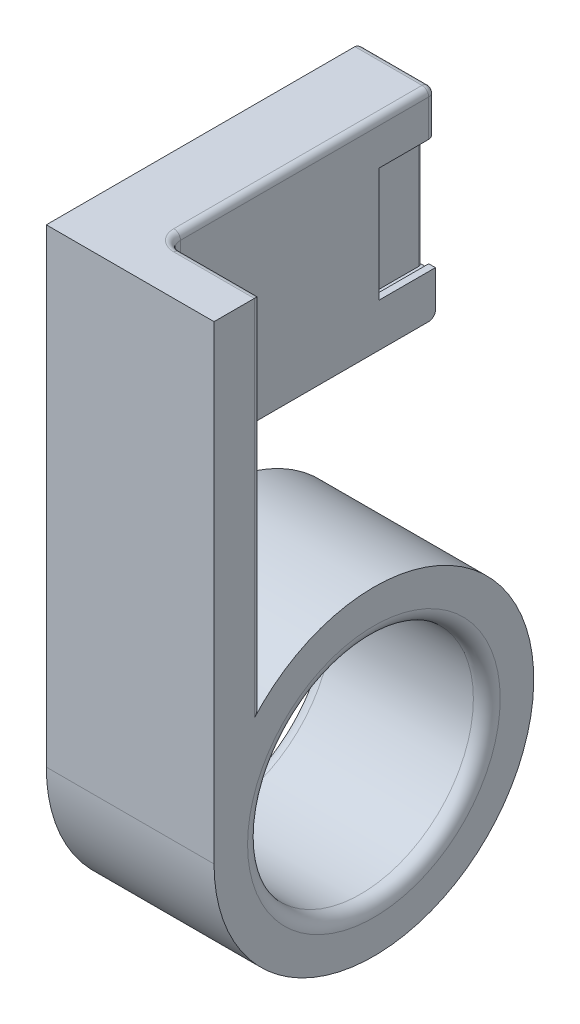
ISO-10303-21;
HEADER;
FILE_DESCRIPTION(('STEP AP214'),'2;1');
FILE_NAME('part.step','',(''),(''),'','','');
FILE_SCHEMA(('AUTOMOTIVE_DESIGN { 1 0 10303 214 1 1 1 1 }'));
ENDSEC;
DATA;
#1=APPLICATION_CONTEXT('core data for automotive mechanical design processes');
#2=APPLICATION_PROTOCOL_DEFINITION('international standard','automotive_design',2000,#1);
#3=PRODUCT_CONTEXT('',#1,'mechanical');
#4=PRODUCT('Part','Part','',(#3));
#5=PRODUCT_RELATED_PRODUCT_CATEGORY('part','',(#4));
#6=PRODUCT_DEFINITION_FORMATION('','',#4);
#7=PRODUCT_DEFINITION_CONTEXT('part definition',#1,'design');
#8=PRODUCT_DEFINITION('design','',#6,#7);
#9=PRODUCT_DEFINITION_SHAPE('','',#8);
#10=(LENGTH_UNIT() NAMED_UNIT(*) SI_UNIT(.MILLI.,.METRE.));
#11=(NAMED_UNIT(*) PLANE_ANGLE_UNIT() SI_UNIT($,.RADIAN.));
#12=(NAMED_UNIT(*) SI_UNIT($,.STERADIAN.) SOLID_ANGLE_UNIT());
#13=UNCERTAINTY_MEASURE_WITH_UNIT(LENGTH_MEASURE(1.E-05),#10,'distance_accuracy_value','');
#14=(GEOMETRIC_REPRESENTATION_CONTEXT(3) GLOBAL_UNCERTAINTY_ASSIGNED_CONTEXT((#13)) GLOBAL_UNIT_ASSIGNED_CONTEXT((#10,
#11,#12)) REPRESENTATION_CONTEXT('',''));
#15=CARTESIAN_POINT('',(0.,0.,0.));
#16=DIRECTION('',(0.,0.,1.));
#17=DIRECTION('',(1.,0.,0.));
#18=AXIS2_PLACEMENT_3D('',#15,#16,#17);
#19=CARTESIAN_POINT('',(11.,70.,-23.1725));
#20=DIRECTION('',(-1.,0.,0.));
#21=DIRECTION('',(0.,-1.,0.));
#22=AXIS2_PLACEMENT_3D('',#19,#20,#21);
#23=PLANE('',#22);
#24=DIRECTION('',(0.,0.,-1.));
#25=VECTOR('',#24,1.);
#26=CARTESIAN_POINT('',(11.,63.525,0.));
#27=LINE('',#26,#25);
#28=CARTESIAN_POINT('',(11.,63.525,-14.7725));
#29=VERTEX_POINT('',#28);
#30=CARTESIAN_POINT('',(11.,63.525,-22.1725));
#31=VERTEX_POINT('',#30);
#32=EDGE_CURVE('E259',#29,#31,#27,.T.);
#33=ORIENTED_EDGE('',*,*,#32,.T.);
#34=DIRECTION('',(0.,-1.,0.));
#35=VECTOR('',#34,1.);
#36=CARTESIAN_POINT('',(11.,70.,-22.1725));
#37=LINE('',#36,#35);
#38=CARTESIAN_POINT('',(11.,69.,-22.1725));
#39=VERTEX_POINT('',#38);
#40=EDGE_CURVE('E410',#31,#39,#37,.F.);
#41=ORIENTED_EDGE('',*,*,#40,.T.);
#42=DIRECTION('',(0.,0.,1.));
#43=VECTOR('',#42,1.);
#44=CARTESIAN_POINT('',(11.,69.,-23.1725));
#45=LINE('',#44,#43);
#46=CARTESIAN_POINT('',(11.,69.,14.8275));
#47=VERTEX_POINT('',#46);
#48=EDGE_CURVE('E407',#39,#47,#45,.T.);
#49=ORIENTED_EDGE('',*,*,#48,.T.);
#50=DIRECTION('',(0.,-1.,0.));
#51=VECTOR('',#50,1.);
#52=CARTESIAN_POINT('',(11.,40.,14.8275));
#53=LINE('',#52,#51);
#54=CARTESIAN_POINT('',(11.,40.,14.8275));
#55=VERTEX_POINT('',#54);
#56=EDGE_CURVE('E390',#47,#55,#53,.T.);
#57=ORIENTED_EDGE('',*,*,#56,.T.);
#58=DIRECTION('',(0.,0.,1.));
#59=VECTOR('',#58,1.);
#60=CARTESIAN_POINT('',(11.,40.,-23.1725));
#61=LINE('',#60,#59);
#62=CARTESIAN_POINT('',(11.,40.,-22.1725));
#63=VERTEX_POINT('',#62);
#64=EDGE_CURVE('E296',#63,#55,#61,.T.);
#65=ORIENTED_EDGE('',*,*,#64,.F.);
#66=CARTESIAN_POINT('',(11.,41.,-22.1725));
#67=DIRECTION('',(-1.,0.,0.));
#68=DIRECTION('',(0.,-1.,0.));
#69=AXIS2_PLACEMENT_3D('',#66,#67,#68);
#70=CIRCLE('',#69,1.);
#71=CARTESIAN_POINT('',(11.,41.,-23.1725));
#72=VERTEX_POINT('',#71);
#73=EDGE_CURVE('E358',#63,#72,#70,.F.);
#74=ORIENTED_EDGE('',*,*,#73,.T.);
#75=DIRECTION('',(0.,-1.,0.));
#76=VECTOR('',#75,1.);
#77=CARTESIAN_POINT('',(11.,70.,-23.1725));
#78=LINE('',#77,#76);
#79=CARTESIAN_POINT('',(11.,46.475,-23.1725));
#80=VERTEX_POINT('',#79);
#81=EDGE_CURVE('E286',#80,#72,#78,.T.);
#82=ORIENTED_EDGE('',*,*,#81,.F.);
#83=DIRECTION('',(0.,0.,-1.));
#84=VECTOR('',#83,1.);
#85=CARTESIAN_POINT('',(11.,46.475,0.));
#86=LINE('',#85,#84);
#87=CARTESIAN_POINT('',(11.,46.475,-14.7725));
#88=VERTEX_POINT('',#87);
#89=EDGE_CURVE('E270',#88,#80,#86,.T.);
#90=ORIENTED_EDGE('',*,*,#89,.F.);
#91=DIRECTION('',(0.,-1.,0.));
#92=VECTOR('',#91,1.);
#93=CARTESIAN_POINT('',(11.,0.,-14.7725));
#94=LINE('',#93,#92);
#95=EDGE_CURVE('E250',#29,#88,#94,.T.);
#96=ORIENTED_EDGE('',*,*,#95,.F.);
#97=EDGE_LOOP('',(#33,#41,#49,#57,#65,#74,#82,#90,#96));
#98=FACE_BOUND('',#97,.T.);
#99=ADVANCED_FACE('F47',(#98),#23,.F.);
#100=CARTESIAN_POINT('',(0.,0.,-23.1725));
#101=DIRECTION('',(0.,0.,1.));
#102=DIRECTION('',(1.,0.,0.));
#103=AXIS2_PLACEMENT_3D('',#100,#101,#102);
#104=PLANE('',#103);
#105=DIRECTION('',(1.,0.,0.));
#106=VECTOR('',#105,1.);
#107=CARTESIAN_POINT('',(0.,69.,-23.1725));
#108=LINE('',#107,#106);
#109=CARTESIAN_POINT('',(1.,69.,-23.1725));
#110=VERTEX_POINT('',#109);
#111=CARTESIAN_POINT('',(10.,69.,-23.1725));
#112=VERTEX_POINT('',#111);
#113=EDGE_CURVE('E344',#110,#112,#108,.T.);
#114=ORIENTED_EDGE('',*,*,#113,.T.);
#115=DIRECTION('',(0.,-1.,0.));
#116=VECTOR('',#115,1.);
#117=CARTESIAN_POINT('',(9.99999999999999,0.,-23.1725));
#118=LINE('',#117,#116);
#119=CARTESIAN_POINT('',(10.,64.125,-23.1725));
#120=VERTEX_POINT('',#119);
#121=EDGE_CURVE('E400',#112,#120,#118,.T.);
#122=ORIENTED_EDGE('',*,*,#121,.T.);
#123=DIRECTION('',(1.,0.,0.));
#124=VECTOR('',#123,1.);
#125=CARTESIAN_POINT('',(9.,64.125,-23.1725));
#126=LINE('',#125,#124);
#127=CARTESIAN_POINT('',(8.49999999999999,64.125,-23.1725));
#128=VERTEX_POINT('',#127);
#129=EDGE_CURVE('E224',#128,#120,#126,.T.);
#130=ORIENTED_EDGE('',*,*,#129,.F.);
#131=DIRECTION('',(0.,1.,0.));
#132=VECTOR('',#131,1.);
#133=CARTESIAN_POINT('',(8.49999999999999,45.875,-23.1725));
#134=LINE('',#133,#132);
#135=CARTESIAN_POINT('',(8.49999999999999,45.875,-23.1725));
#136=VERTEX_POINT('',#135);
#137=EDGE_CURVE('E334',#128,#136,#134,.F.);
#138=ORIENTED_EDGE('',*,*,#137,.T.);
#139=DIRECTION('',(1.,0.,0.));
#140=VECTOR('',#139,1.);
#141=CARTESIAN_POINT('',(8.99999999999999,45.875,-23.1725));
#142=LINE('',#141,#140);
#143=CARTESIAN_POINT('',(9.99999999999999,45.875,-23.1725));
#144=VERTEX_POINT('',#143);
#145=EDGE_CURVE('E246',#136,#144,#142,.T.);
#146=ORIENTED_EDGE('',*,*,#145,.T.);
#147=DIRECTION('',(0.,1.,0.));
#148=VECTOR('',#147,1.);
#149=CARTESIAN_POINT('',(10.,64.125,-23.1725));
#150=LINE('',#149,#148);
#151=CARTESIAN_POINT('',(9.99999999999999,46.475,-23.1725));
#152=VERTEX_POINT('',#151);
#153=EDGE_CURVE('E233',#144,#152,#150,.T.);
#154=ORIENTED_EDGE('',*,*,#153,.T.);
#155=DIRECTION('',(1.,0.,0.));
#156=VECTOR('',#155,1.);
#157=CARTESIAN_POINT('',(9.99999999999999,46.475,-23.1725));
#158=LINE('',#157,#156);
#159=EDGE_CURVE('E280',#152,#80,#158,.T.);
#160=ORIENTED_EDGE('',*,*,#159,.T.);
#161=ORIENTED_EDGE('',*,*,#81,.T.);
#162=DIRECTION('',(-1.,0.,0.));
#163=VECTOR('',#162,1.);
#164=CARTESIAN_POINT('',(0.,41.,-23.1725));
#165=LINE('',#164,#163);
#166=CARTESIAN_POINT('',(1.,41.,-23.1725));
#167=VERTEX_POINT('',#166);
#168=EDGE_CURVE('E351',#72,#167,#165,.T.);
#169=ORIENTED_EDGE('',*,*,#168,.T.);
#170=DIRECTION('',(0.,1.,0.));
#171=VECTOR('',#170,1.);
#172=CARTESIAN_POINT('',(1.,0.,-23.1725));
#173=LINE('',#172,#171);
#174=EDGE_CURVE('E348',#167,#110,#173,.T.);
#175=ORIENTED_EDGE('',*,*,#174,.T.);
#176=EDGE_LOOP('',(#114,#122,#130,#138,#146,#154,#160,#161,#169,#175));
#177=FACE_BOUND('',#176,.T.);
#178=ADVANCED_FACE('F505',(#177),#104,.F.);
#179=CARTESIAN_POINT('',(0.,70.,16.8275));
#180=DIRECTION('',(0.,0.,1.));
#181=DIRECTION('',(1.,0.,0.));
#182=AXIS2_PLACEMENT_3D('',#179,#180,#181);
#183=PLANE('',#182);
#184=DIRECTION('',(0.,-1.,0.));
#185=VECTOR('',#184,1.);
#186=CARTESIAN_POINT('',(13.,70.,16.8275));
#187=LINE('',#186,#185);
#188=CARTESIAN_POINT('',(13.,40.,16.8275));
#189=VERTEX_POINT('',#188);
#190=CARTESIAN_POINT('',(13.,69.,16.8275));
#191=VERTEX_POINT('',#190);
#192=EDGE_CURVE('E393',#189,#191,#187,.F.);
#193=ORIENTED_EDGE('',*,*,#192,.T.);
#194=DIRECTION('',(-1.,0.,0.));
#195=VECTOR('',#194,1.);
#196=CARTESIAN_POINT('',(0.,69.,16.8275));
#197=LINE('',#196,#195);
#198=CARTESIAN_POINT('',(24.,69.,16.8275));
#199=VERTEX_POINT('',#198);
#200=EDGE_CURVE('E73',#191,#199,#197,.F.);
#201=ORIENTED_EDGE('',*,*,#200,.T.);
#202=DIRECTION('',(0.,-1.,0.));
#203=VECTOR('',#202,1.);
#204=CARTESIAN_POINT('',(24.,16.8696472992176,16.8275));
#205=LINE('',#204,#203);
#206=CARTESIAN_POINT('',(24.,16.8696472992176,16.8275));
#207=VERTEX_POINT('',#206);
#208=EDGE_CURVE('E428',#199,#207,#205,.T.);
#209=ORIENTED_EDGE('',*,*,#208,.T.);
#210=DIRECTION('',(-1.,0.,0.));
#211=VECTOR('',#210,1.);
#212=CARTESIAN_POINT('',(25.,16.8696472992176,16.8275));
#213=LINE('',#212,#211);
#214=CARTESIAN_POINT('',(0.,16.8696472992176,16.8275));
#215=VERTEX_POINT('',#214);
#216=EDGE_CURVE('E323',#207,#215,#213,.T.);
#217=ORIENTED_EDGE('',*,*,#216,.T.);
#218=DIRECTION('',(0.,-1.,0.));
#219=VECTOR('',#218,1.);
#220=CARTESIAN_POINT('',(0.,70.,16.8275));
#221=LINE('',#220,#219);
#222=CARTESIAN_POINT('',(0.,40.,16.8275));
#223=VERTEX_POINT('',#222);
#224=EDGE_CURVE('E311',#223,#215,#221,.T.);
#225=ORIENTED_EDGE('',*,*,#224,.F.);
#226=DIRECTION('',(-1.,0.,0.));
#227=VECTOR('',#226,1.);
#228=CARTESIAN_POINT('',(0.,40.,16.8275));
#229=LINE('',#228,#227);
#230=EDGE_CURVE('E279',#189,#223,#229,.T.);
#231=ORIENTED_EDGE('',*,*,#230,.F.);
#232=EDGE_LOOP('',(#193,#201,#209,#217,#225,#231));
#233=FACE_BOUND('',#232,.T.);
#234=ADVANCED_FACE('F448',(#233),#183,.F.);
#235=CARTESIAN_POINT('',(25.,0.,0.));
#236=DIRECTION('',(-1.,0.,0.));
#237=DIRECTION('',(0.,0.,1.));
#238=AXIS2_PLACEMENT_3D('',#235,#236,#237);
#239=CYLINDRICAL_SURFACE('',#238,23.8275);
#240=ORIENTED_EDGE('',*,*,#216,.F.);
#241=CARTESIAN_POINT('',(24.,16.8696472992176,16.8275));
#242=CARTESIAN_POINT('',(24.0223321953834,16.8696498950098,16.82749706627));
#243=CARTESIAN_POINT('',(24.0446507963139,16.8689004392366,16.8282487587657));
#244=CARTESIAN_POINT('',(24.0890747432787,16.8659291114791,16.831226878695));
#245=CARTESIAN_POINT('',(24.1111802330279,16.8637083142068,16.8334522297235));
#246=CARTESIAN_POINT('',(24.1765512492954,16.8549378412514,16.8422355300591));
#247=CARTESIAN_POINT('',(24.2192805946417,16.8462787728542,16.8509021340499));
#248=CARTESIAN_POINT('',(24.3018610384001,16.8239564935338,16.8731883968484));
#249=CARTESIAN_POINT('',(24.3417191907424,16.8103060847704,16.8867953835723));
#250=CARTESIAN_POINT('',(24.4180506587688,16.778763037669,16.9181371053342));
#251=CARTESIAN_POINT('',(24.4545164891371,16.7608613137907,16.9358806792177));
#252=CARTESIAN_POINT('',(24.5372270029839,16.7138904538123,16.9822579689447));
#253=CARTESIAN_POINT('',(24.5816838206511,16.6831972503766,17.0124312203849));
#254=CARTESIAN_POINT('',(24.6631006809441,16.6169370786145,17.0771577873296));
#255=CARTESIAN_POINT('',(24.7000483375857,16.5813622175402,17.1117181891329));
#256=CARTESIAN_POINT('',(24.7804039898547,16.4914977047304,17.19841715247));
#257=CARTESIAN_POINT('',(24.8203260401363,16.4354818885304,17.2519873802441));
#258=CARTESIAN_POINT('',(24.8875318334827,16.3189796510539,17.3622333177089));
#259=CARTESIAN_POINT('',(24.9147762987686,16.2584800003236,17.418918078295));
#260=CARTESIAN_POINT('',(24.9581388777354,16.1337446069012,17.5345196869928));
#261=CARTESIAN_POINT('',(24.974070215196,16.0694643090113,17.5934577979775));
#262=CARTESIAN_POINT('',(24.9897532171683,15.9721816209426,17.6816593172942));
#263=CARTESIAN_POINT('',(24.9936126520603,15.9397519525038,17.7108999555428));
#264=CARTESIAN_POINT('',(24.9987329320784,15.8746355502515,17.7692884997771));
#265=CARTESIAN_POINT('',(24.9999951680502,15.8419489634418,17.7984364470456));
#266=CARTESIAN_POINT('',(25.,15.8091745515065,17.8275));
#267=B_SPLINE_CURVE_WITH_KNOTS('',3,(#241,#242,#243,#244,#245,#246,#247,#248,#249,#250,#251,
#252,#253,#254,#255,#256,#257,#258,#259,#260,#261,#262,#263,#264,#265,#266),.UNSPECIFIED.,.F.,
.F.,(4,2,2,2,2,2,2,2,2,2,2,2,4),(0.,0.0669455816477829,0.133842318058016,0.266427089311162,
0.398674155715438,0.531206433567357,0.715815782619488,0.900727207443907,1.16085811194837,
1.4217896760432,1.68693484312092,1.81837913789949,1.94975302360801),.UNSPECIFIED.);
#268=CARTESIAN_POINT('',(25.,15.8091745515065,17.8275));
#269=VERTEX_POINT('',#268);
#270=EDGE_CURVE('E12',#207,#269,#267,.T.);
#271=ORIENTED_EDGE('',*,*,#270,.T.);
#272=CARTESIAN_POINT('',(25.,0.,0.));
#273=DIRECTION('',(1.,0.,0.));
#274=DIRECTION('',(0.,0.,-1.));
#275=AXIS2_PLACEMENT_3D('',#272,#273,#274);
#276=CIRCLE('',#275,23.8275);
#277=CARTESIAN_POINT('',(25.,0.,23.8275));
#278=VERTEX_POINT('',#277);
#279=EDGE_CURVE('E66',#278,#269,#276,.T.);
#280=ORIENTED_EDGE('',*,*,#279,.F.);
#281=DIRECTION('',(1.,0.,0.));
#282=VECTOR('',#281,1.);
#283=CARTESIAN_POINT('',(0.,0.,23.8275));
#284=LINE('',#283,#282);
#285=CARTESIAN_POINT('',(0.,0.,23.8275));
#286=VERTEX_POINT('',#285);
#287=EDGE_CURVE('E300',#286,#278,#284,.T.);
#288=ORIENTED_EDGE('',*,*,#287,.F.);
#289=CARTESIAN_POINT('',(0.,0.,0.));
#290=DIRECTION('',(1.,0.,0.));
#291=DIRECTION('',(0.,0.,-1.));
#292=AXIS2_PLACEMENT_3D('',#289,#290,#291);
#293=CIRCLE('',#292,23.8275);
#294=EDGE_CURVE('E326',#286,#215,#293,.T.);
#295=ORIENTED_EDGE('',*,*,#294,.T.);
#296=EDGE_LOOP('',(#240,#271,#280,#288,#295));
#297=FACE_BOUND('',#296,.T.);
#298=ADVANCED_FACE('F442',(#297),#239,.T.);
#299=CARTESIAN_POINT('',(25.,0.,0.));
#300=DIRECTION('',(1.,0.,0.));
#301=DIRECTION('',(0.,0.,-1.));
#302=AXIS2_PLACEMENT_3D('',#299,#300,#301);
#303=PLANE('',#302);
#304=CARTESIAN_POINT('',(25.,0.,0.));
#305=DIRECTION('',(1.,0.,0.));
#306=DIRECTION('',(0.,0.,-1.));
#307=AXIS2_PLACEMENT_3D('',#304,#305,#306);
#308=CIRCLE('',#307,18.8275);
#309=CARTESIAN_POINT('',(25.,0.,-18.8275));
#310=VERTEX_POINT('',#309);
#311=EDGE_CURVE('E382',#310,#310,#308,.F.);
#312=ORIENTED_EDGE('',*,*,#311,.T.);
#313=EDGE_LOOP('',(#312));
#314=FACE_BOUND('',#313,.T.);
#315=ORIENTED_EDGE('',*,*,#279,.T.);
#316=DIRECTION('',(0.,-1.,0.));
#317=VECTOR('',#316,1.);
#318=CARTESIAN_POINT('',(25.,70.,17.8275));
#319=LINE('',#318,#317);
#320=CARTESIAN_POINT('',(25.,70.,17.8275));
#321=VERTEX_POINT('',#320);
#322=EDGE_CURVE('E58',#269,#321,#319,.F.);
#323=ORIENTED_EDGE('',*,*,#322,.T.);
#324=DIRECTION('',(0.,0.,-1.));
#325=VECTOR('',#324,1.);
#326=CARTESIAN_POINT('',(25.,70.,23.8275));
#327=LINE('',#326,#325);
#328=CARTESIAN_POINT('',(25.,70.,23.8275));
#329=VERTEX_POINT('',#328);
#330=EDGE_CURVE('E307',#329,#321,#327,.T.);
#331=ORIENTED_EDGE('',*,*,#330,.F.);
#332=DIRECTION('',(0.,-1.,0.));
#333=VECTOR('',#332,1.);
#334=CARTESIAN_POINT('',(25.,70.,23.8275));
#335=LINE('',#334,#333);
#336=EDGE_CURVE('E317',#329,#278,#335,.T.);
#337=ORIENTED_EDGE('',*,*,#336,.T.);
#338=EDGE_LOOP('',(#315,#323,#331,#337));
#339=FACE_BOUND('',#338,.T.);
#340=ADVANCED_FACE('F447',(#314,#339),#303,.T.);
#341=CARTESIAN_POINT('',(0.,0.,0.));
#342=DIRECTION('',(1.,0.,0.));
#343=DIRECTION('',(0.,0.,-1.));
#344=AXIS2_PLACEMENT_3D('',#341,#342,#343);
#345=PLANE('',#344);
#346=CARTESIAN_POINT('',(0.,0.,0.));
#347=DIRECTION('',(1.,0.,0.));
#348=DIRECTION('',(0.,0.,-1.));
#349=AXIS2_PLACEMENT_3D('',#346,#347,#348);
#350=CIRCLE('',#349,18.8275);
#351=CARTESIAN_POINT('',(0.,0.,-18.8275));
#352=VERTEX_POINT('',#351);
#353=EDGE_CURVE('E386',#352,#352,#350,.T.);
#354=ORIENTED_EDGE('',*,*,#353,.T.);
#355=EDGE_LOOP('',(#354));
#356=FACE_BOUND('',#355,.T.);
#357=DIRECTION('',(0.,0.,1.));
#358=VECTOR('',#357,1.);
#359=CARTESIAN_POINT('',(0.,70.,23.8275));
#360=LINE('',#359,#358);
#361=CARTESIAN_POINT('',(0.,70.,-22.1725));
#362=VERTEX_POINT('',#361);
#363=CARTESIAN_POINT('',(0.,70.,23.8275));
#364=VERTEX_POINT('',#363);
#365=EDGE_CURVE('E301',#362,#364,#360,.T.);
#366=ORIENTED_EDGE('',*,*,#365,.F.);
#367=DIRECTION('',(0.,1.,0.));
#368=VECTOR('',#367,1.);
#369=CARTESIAN_POINT('',(0.,0.,-22.1725));
#370=LINE('',#369,#368);
#371=CARTESIAN_POINT('',(0.,40.,-22.1725));
#372=VERTEX_POINT('',#371);
#373=EDGE_CURVE('E361',#362,#372,#370,.F.);
#374=ORIENTED_EDGE('',*,*,#373,.T.);
#375=DIRECTION('',(0.,0.,1.));
#376=VECTOR('',#375,1.);
#377=CARTESIAN_POINT('',(0.,40.,-23.1725));
#378=LINE('',#377,#376);
#379=EDGE_CURVE('E290',#372,#223,#378,.T.);
#380=ORIENTED_EDGE('',*,*,#379,.T.);
#381=ORIENTED_EDGE('',*,*,#224,.T.);
#382=ORIENTED_EDGE('',*,*,#294,.F.);
#383=DIRECTION('',(0.,-1.,0.));
#384=VECTOR('',#383,1.);
#385=CARTESIAN_POINT('',(0.,70.,23.8275));
#386=LINE('',#385,#384);
#387=EDGE_CURVE('E320',#364,#286,#386,.T.);
#388=ORIENTED_EDGE('',*,*,#387,.F.);
#389=EDGE_LOOP('',(#366,#374,#380,#381,#382,#388));
#390=FACE_BOUND('',#389,.T.);
#391=ADVANCED_FACE('F450',(#356,#390),#345,.F.);
#392=CARTESIAN_POINT('',(25.,0.,0.));
#393=DIRECTION('',(-1.,0.,0.));
#394=DIRECTION('',(0.,0.,1.));
#395=AXIS2_PLACEMENT_3D('',#392,#393,#394);
#396=CYLINDRICAL_SURFACE('',#395,16.8275);
#397=CARTESIAN_POINT('',(23.,0.,0.));
#398=DIRECTION('',(1.,0.,0.));
#399=DIRECTION('',(0.,0.,-1.));
#400=AXIS2_PLACEMENT_3D('',#397,#398,#399);
#401=CIRCLE('',#400,16.8275);
#402=CARTESIAN_POINT('',(23.,0.,-16.8275));
#403=VERTEX_POINT('',#402);
#404=EDGE_CURVE('E378',#403,#403,#401,.T.);
#405=ORIENTED_EDGE('',*,*,#404,.T.);
#406=EDGE_LOOP('',(#405));
#407=FACE_BOUND('',#406,.T.);
#408=CARTESIAN_POINT('',(2.,0.,0.));
#409=DIRECTION('',(1.,0.,0.));
#410=DIRECTION('',(0.,0.,-1.));
#411=AXIS2_PLACEMENT_3D('',#408,#409,#410);
#412=CIRCLE('',#411,16.8275);
#413=CARTESIAN_POINT('',(2.,0.,-16.8275));
#414=VERTEX_POINT('',#413);
#415=EDGE_CURVE('E367',#414,#414,#412,.F.);
#416=ORIENTED_EDGE('',*,*,#415,.T.);
#417=EDGE_LOOP('',(#416));
#418=FACE_BOUND('',#417,.T.);
#419=ADVANCED_FACE('F525',(#407,#418),#396,.F.);
#420=CARTESIAN_POINT('',(0.,70.,23.8275));
#421=DIRECTION('',(0.,0.,-1.));
#422=DIRECTION('',(-1.,0.,0.));
#423=AXIS2_PLACEMENT_3D('',#420,#421,#422);
#424=PLANE('',#423);
#425=ORIENTED_EDGE('',*,*,#287,.T.);
#426=ORIENTED_EDGE('',*,*,#336,.F.);
#427=DIRECTION('',(1.,0.,0.));
#428=VECTOR('',#427,1.);
#429=CARTESIAN_POINT('',(0.,70.,23.8275));
#430=LINE('',#429,#428);
#431=EDGE_CURVE('E304',#364,#329,#430,.T.);
#432=ORIENTED_EDGE('',*,*,#431,.F.);
#433=ORIENTED_EDGE('',*,*,#387,.T.);
#434=EDGE_LOOP('',(#425,#426,#432,#433));
#435=FACE_BOUND('',#434,.T.);
#436=ADVANCED_FACE('F519',(#435),#424,.F.);
#437=CARTESIAN_POINT('',(0.,70.,0.));
#438=DIRECTION('',(0.,-1.,0.));
#439=DIRECTION('',(0.,0.,-1.));
#440=AXIS2_PLACEMENT_3D('',#437,#438,#439);
#441=PLANE('',#440);
#442=CARTESIAN_POINT('',(13.,70.,14.8275));
#443=DIRECTION('',(0.,-1.,0.));
#444=DIRECTION('',(0.,0.,-1.));
#445=AXIS2_PLACEMENT_3D('',#442,#443,#444);
#446=CIRCLE('',#445,3.);
#447=CARTESIAN_POINT('',(13.,70.,17.8275));
#448=VERTEX_POINT('',#447);
#449=CARTESIAN_POINT('',(10.,70.,14.8275));
#450=VERTEX_POINT('',#449);
#451=EDGE_CURVE('E419',#448,#450,#446,.T.);
#452=ORIENTED_EDGE('',*,*,#451,.T.);
#453=DIRECTION('',(0.,0.,1.));
#454=VECTOR('',#453,1.);
#455=CARTESIAN_POINT('',(10.,70.,0.));
#456=LINE('',#455,#454);
#457=CARTESIAN_POINT('',(10.,70.,-22.1725));
#458=VERTEX_POINT('',#457);
#459=EDGE_CURVE('E422',#450,#458,#456,.F.);
#460=ORIENTED_EDGE('',*,*,#459,.T.);
#461=DIRECTION('',(1.,0.,0.));
#462=VECTOR('',#461,1.);
#463=CARTESIAN_POINT('',(0.,70.,-22.1725));
#464=LINE('',#463,#462);
#465=EDGE_CURVE('E364',#458,#362,#464,.F.);
#466=ORIENTED_EDGE('',*,*,#465,.T.);
#467=ORIENTED_EDGE('',*,*,#365,.T.);
#468=ORIENTED_EDGE('',*,*,#431,.T.);
#469=ORIENTED_EDGE('',*,*,#330,.T.);
#470=DIRECTION('',(-1.,0.,0.));
#471=VECTOR('',#470,1.);
#472=CARTESIAN_POINT('',(0.,70.,17.8275));
#473=LINE('',#472,#471);
#474=EDGE_CURVE('E416',#321,#448,#473,.T.);
#475=ORIENTED_EDGE('',*,*,#474,.T.);
#476=EDGE_LOOP('',(#452,#460,#466,#467,#468,#469,#475));
#477=FACE_BOUND('',#476,.T.);
#478=ADVANCED_FACE('F516',(#477),#441,.F.);
#479=CARTESIAN_POINT('',(0.,40.,-23.1725));
#480=DIRECTION('',(0.,1.,0.));
#481=DIRECTION('',(0.,0.,1.));
#482=AXIS2_PLACEMENT_3D('',#479,#480,#481);
#483=PLANE('',#482);
#484=ORIENTED_EDGE('',*,*,#379,.F.);
#485=DIRECTION('',(-1.,0.,0.));
#486=VECTOR('',#485,1.);
#487=CARTESIAN_POINT('',(0.,40.,-22.1725));
#488=LINE('',#487,#486);
#489=EDGE_CURVE('E355',#372,#63,#488,.F.);
#490=ORIENTED_EDGE('',*,*,#489,.T.);
#491=ORIENTED_EDGE('',*,*,#64,.T.);
#492=CARTESIAN_POINT('',(13.,40.,14.8275));
#493=DIRECTION('',(0.,1.,0.));
#494=DIRECTION('',(0.,0.,1.));
#495=AXIS2_PLACEMENT_3D('',#492,#493,#494);
#496=CIRCLE('',#495,2.);
#497=EDGE_CURVE('E396',#55,#189,#496,.T.);
#498=ORIENTED_EDGE('',*,*,#497,.T.);
#499=ORIENTED_EDGE('',*,*,#230,.T.);
#500=EDGE_LOOP('',(#484,#490,#491,#498,#499));
#501=FACE_BOUND('',#500,.T.);
#502=ADVANCED_FACE('F515',(#501),#483,.F.);
#503=CARTESIAN_POINT('',(9.99999999999999,0.,-14.7725));
#504=DIRECTION('',(0.,0.,1.));
#505=DIRECTION('',(0.,-1.,0.));
#506=AXIS2_PLACEMENT_3D('',#503,#504,#505);
#507=PLANE('',#506);
#508=ORIENTED_EDGE('',*,*,#95,.T.);
#509=DIRECTION('',(1.,0.,0.));
#510=VECTOR('',#509,1.);
#511=CARTESIAN_POINT('',(9.99999999999999,46.475,-14.7725));
#512=LINE('',#511,#510);
#513=CARTESIAN_POINT('',(9.99999999999999,46.475,-14.7725));
#514=VERTEX_POINT('',#513);
#515=EDGE_CURVE('E266',#514,#88,#512,.T.);
#516=ORIENTED_EDGE('',*,*,#515,.F.);
#517=DIRECTION('',(0.,-1.,0.));
#518=VECTOR('',#517,1.);
#519=CARTESIAN_POINT('',(9.99999999999999,0.,-14.7725));
#520=LINE('',#519,#518);
#521=CARTESIAN_POINT('',(10.,63.525,-14.7725));
#522=VERTEX_POINT('',#521);
#523=EDGE_CURVE('E255',#522,#514,#520,.T.);
#524=ORIENTED_EDGE('',*,*,#523,.F.);
#525=DIRECTION('',(1.,0.,0.));
#526=VECTOR('',#525,1.);
#527=CARTESIAN_POINT('',(10.,63.525,-14.7725));
#528=LINE('',#527,#526);
#529=EDGE_CURVE('E276',#522,#29,#528,.T.);
#530=ORIENTED_EDGE('',*,*,#529,.T.);
#531=EDGE_LOOP('',(#508,#516,#524,#530));
#532=FACE_BOUND('',#531,.T.);
#533=ADVANCED_FACE('F601',(#532),#507,.F.);
#534=CARTESIAN_POINT('',(10.,63.525,0.));
#535=DIRECTION('',(0.,-1.,0.));
#536=DIRECTION('',(1.,0.,0.));
#537=AXIS2_PLACEMENT_3D('',#534,#535,#536);
#538=PLANE('',#537);
#539=DIRECTION('',(0.,0.,-1.));
#540=VECTOR('',#539,1.);
#541=CARTESIAN_POINT('',(10.,63.525,0.));
#542=LINE('',#541,#540);
#543=CARTESIAN_POINT('',(10.,63.525,-23.1725));
#544=VERTEX_POINT('',#543);
#545=EDGE_CURVE('E262',#522,#544,#542,.T.);
#546=ORIENTED_EDGE('',*,*,#545,.T.);
#547=CARTESIAN_POINT('',(10.,63.525,-22.1725));
#548=DIRECTION('',(0.,-1.,0.));
#549=DIRECTION('',(1.,0.,0.));
#550=AXIS2_PLACEMENT_3D('',#547,#548,#549);
#551=CIRCLE('',#550,1.);
#552=EDGE_CURVE('E404',#544,#31,#551,.T.);
#553=ORIENTED_EDGE('',*,*,#552,.T.);
#554=ORIENTED_EDGE('',*,*,#32,.F.);
#555=ORIENTED_EDGE('',*,*,#529,.F.);
#556=EDGE_LOOP('',(#546,#553,#554,#555));
#557=FACE_BOUND('',#556,.T.);
#558=ADVANCED_FACE('F605',(#557),#538,.T.);
#559=CARTESIAN_POINT('',(9.99999999999999,46.475,0.));
#560=DIRECTION('',(0.,-1.,0.));
#561=DIRECTION('',(1.,0.,0.));
#562=AXIS2_PLACEMENT_3D('',#559,#560,#561);
#563=PLANE('',#562);
#564=ORIENTED_EDGE('',*,*,#89,.T.);
#565=ORIENTED_EDGE('',*,*,#159,.F.);
#566=DIRECTION('',(0.,0.,-1.));
#567=VECTOR('',#566,1.);
#568=CARTESIAN_POINT('',(9.99999999999999,46.475,0.));
#569=LINE('',#568,#567);
#570=EDGE_CURVE('E258',#514,#152,#569,.T.);
#571=ORIENTED_EDGE('',*,*,#570,.F.);
#572=ORIENTED_EDGE('',*,*,#515,.T.);
#573=EDGE_LOOP('',(#564,#565,#571,#572));
#574=FACE_BOUND('',#573,.T.);
#575=ADVANCED_FACE('F596',(#574),#563,.F.);
#576=CARTESIAN_POINT('',(8.99999999999999,45.875,-14.1725));
#577=DIRECTION('',(0.,-1.,0.));
#578=DIRECTION('',(1.,0.,0.));
#579=AXIS2_PLACEMENT_3D('',#576,#577,#578);
#580=PLANE('',#579);
#581=DIRECTION('',(0.,0.,-1.));
#582=VECTOR('',#581,1.);
#583=CARTESIAN_POINT('',(9.99999999999999,45.875,-14.1725));
#584=LINE('',#583,#582);
#585=CARTESIAN_POINT('',(9.99999999999999,45.875,-14.1725));
#586=VERTEX_POINT('',#585);
#587=EDGE_CURVE('E211',#586,#144,#584,.T.);
#588=ORIENTED_EDGE('',*,*,#587,.T.);
#589=ORIENTED_EDGE('',*,*,#145,.F.);
#590=CARTESIAN_POINT('',(8.49999999999999,45.875,-22.6725));
#591=DIRECTION('',(0.,-1.,0.));
#592=DIRECTION('',(1.,0.,0.));
#593=AXIS2_PLACEMENT_3D('',#590,#591,#592);
#594=CIRCLE('',#593,0.5);
#595=CARTESIAN_POINT('',(8.99999999999999,45.875,-22.6725));
#596=VERTEX_POINT('',#595);
#597=EDGE_CURVE('E341',#136,#596,#594,.T.);
#598=ORIENTED_EDGE('',*,*,#597,.T.);
#599=DIRECTION('',(0.,0.,-1.));
#600=VECTOR('',#599,1.);
#601=CARTESIAN_POINT('',(8.99999999999999,45.875,-14.1725));
#602=LINE('',#601,#600);
#603=CARTESIAN_POINT('',(8.99999999999999,45.875,-14.1725));
#604=VERTEX_POINT('',#603);
#605=EDGE_CURVE('E228',#604,#596,#602,.T.);
#606=ORIENTED_EDGE('',*,*,#605,.F.);
#607=DIRECTION('',(1.,0.,0.));
#608=VECTOR('',#607,1.);
#609=CARTESIAN_POINT('',(8.99999999999999,45.875,-14.1725));
#610=LINE('',#609,#608);
#611=EDGE_CURVE('E223',#604,#586,#610,.T.);
#612=ORIENTED_EDGE('',*,*,#611,.T.);
#613=EDGE_LOOP('',(#588,#589,#598,#606,#612));
#614=FACE_BOUND('',#613,.T.);
#615=ADVANCED_FACE('F615',(#614),#580,.F.);
#616=CARTESIAN_POINT('',(9.,64.125,-14.1725));
#617=DIRECTION('',(0.,0.,1.));
#618=DIRECTION('',(1.,0.,0.));
#619=AXIS2_PLACEMENT_3D('',#616,#617,#618);
#620=PLANE('',#619);
#621=DIRECTION('',(0.,-1.,0.));
#622=VECTOR('',#621,1.);
#623=CARTESIAN_POINT('',(10.,64.125,-14.1725));
#624=LINE('',#623,#622);
#625=CARTESIAN_POINT('',(10.,64.125,-14.1725));
#626=VERTEX_POINT('',#625);
#627=EDGE_CURVE('E240',#626,#586,#624,.T.);
#628=ORIENTED_EDGE('',*,*,#627,.T.);
#629=ORIENTED_EDGE('',*,*,#611,.F.);
#630=DIRECTION('',(0.,-1.,0.));
#631=VECTOR('',#630,1.);
#632=CARTESIAN_POINT('',(9.,64.125,-14.1725));
#633=LINE('',#632,#631);
#634=CARTESIAN_POINT('',(9.,64.125,-14.1725));
#635=VERTEX_POINT('',#634);
#636=EDGE_CURVE('E204',#635,#604,#633,.T.);
#637=ORIENTED_EDGE('',*,*,#636,.F.);
#638=DIRECTION('',(1.,0.,0.));
#639=VECTOR('',#638,1.);
#640=CARTESIAN_POINT('',(9.,64.125,-14.1725));
#641=LINE('',#640,#639);
#642=EDGE_CURVE('E214',#635,#626,#641,.T.);
#643=ORIENTED_EDGE('',*,*,#642,.T.);
#644=EDGE_LOOP('',(#628,#629,#637,#643));
#645=FACE_BOUND('',#644,.T.);
#646=ADVANCED_FACE('F226',(#645),#620,.F.);
#647=CARTESIAN_POINT('',(9.,64.125,-14.1725));
#648=DIRECTION('',(0.,1.,0.));
#649=DIRECTION('',(-1.,0.,0.));
#650=AXIS2_PLACEMENT_3D('',#647,#648,#649);
#651=PLANE('',#650);
#652=DIRECTION('',(0.,0.,1.));
#653=VECTOR('',#652,1.);
#654=CARTESIAN_POINT('',(10.,64.125,-14.1725));
#655=LINE('',#654,#653);
#656=EDGE_CURVE('E218',#120,#626,#655,.T.);
#657=ORIENTED_EDGE('',*,*,#656,.T.);
#658=ORIENTED_EDGE('',*,*,#642,.F.);
#659=DIRECTION('',(0.,0.,1.));
#660=VECTOR('',#659,1.);
#661=CARTESIAN_POINT('',(9.,64.125,-14.1725));
#662=LINE('',#661,#660);
#663=CARTESIAN_POINT('',(9.,64.125,-22.6725));
#664=VERTEX_POINT('',#663);
#665=EDGE_CURVE('E199',#664,#635,#662,.T.);
#666=ORIENTED_EDGE('',*,*,#665,.F.);
#667=CARTESIAN_POINT('',(8.49999999999999,64.125,-22.6725));
#668=DIRECTION('',(0.,1.,0.));
#669=DIRECTION('',(-1.,0.,0.));
#670=AXIS2_PLACEMENT_3D('',#667,#668,#669);
#671=CIRCLE('',#670,0.5);
#672=EDGE_CURVE('E338',#664,#128,#671,.T.);
#673=ORIENTED_EDGE('',*,*,#672,.T.);
#674=ORIENTED_EDGE('',*,*,#129,.T.);
#675=EDGE_LOOP('',(#657,#658,#666,#673,#674));
#676=FACE_BOUND('',#675,.T.);
#677=ADVANCED_FACE('F215',(#676),#651,.F.);
#678=CARTESIAN_POINT('',(8.99999999999998,0.,0.));
#679=DIRECTION('',(1.,0.,0.));
#680=DIRECTION('',(0.,1.,0.));
#681=AXIS2_PLACEMENT_3D('',#678,#679,#680);
#682=PLANE('',#681);
#683=ORIENTED_EDGE('',*,*,#605,.T.);
#684=DIRECTION('',(0.,1.,0.));
#685=VECTOR('',#684,1.);
#686=CARTESIAN_POINT('',(9.,64.125,-22.6725));
#687=LINE('',#686,#685);
#688=EDGE_CURVE('E207',#596,#664,#687,.T.);
#689=ORIENTED_EDGE('',*,*,#688,.T.);
#690=ORIENTED_EDGE('',*,*,#665,.T.);
#691=ORIENTED_EDGE('',*,*,#636,.T.);
#692=EDGE_LOOP('',(#683,#689,#690,#691));
#693=FACE_BOUND('',#692,.T.);
#694=ADVANCED_FACE('F202',(#693),#682,.T.);
#695=CARTESIAN_POINT('',(9.99999999999998,0.,0.));
#696=DIRECTION('',(1.,0.,0.));
#697=DIRECTION('',(0.,1.,0.));
#698=AXIS2_PLACEMENT_3D('',#695,#696,#697);
#699=PLANE('',#698);
#700=ORIENTED_EDGE('',*,*,#545,.F.);
#701=ORIENTED_EDGE('',*,*,#523,.T.);
#702=ORIENTED_EDGE('',*,*,#570,.T.);
#703=ORIENTED_EDGE('',*,*,#153,.F.);
#704=ORIENTED_EDGE('',*,*,#587,.F.);
#705=ORIENTED_EDGE('',*,*,#627,.F.);
#706=ORIENTED_EDGE('',*,*,#656,.F.);
#707=EDGE_CURVE('E237',#544,#120,#150,.T.);
#708=ORIENTED_EDGE('',*,*,#707,.F.);
#709=EDGE_LOOP('',(#700,#701,#702,#703,#704,#705,#706,#708));
#710=FACE_BOUND('',#709,.T.);
#711=ADVANCED_FACE('F456',(#710),#699,.F.);
#712=CARTESIAN_POINT('',(8.49999999999998,0.,-22.6725));
#713=DIRECTION('',(0.,-1.,0.));
#714=DIRECTION('',(1.,0.,0.));
#715=AXIS2_PLACEMENT_3D('',#712,#713,#714);
#716=CYLINDRICAL_SURFACE('',#715,0.5);
#717=ORIENTED_EDGE('',*,*,#597,.F.);
#718=ORIENTED_EDGE('',*,*,#137,.F.);
#719=ORIENTED_EDGE('',*,*,#672,.F.);
#720=ORIENTED_EDGE('',*,*,#688,.F.);
#721=EDGE_LOOP('',(#717,#718,#719,#720));
#722=FACE_BOUND('',#721,.T.);
#723=ADVANCED_FACE('F452',(#722),#716,.T.);
#724=CARTESIAN_POINT('',(0.,69.,-22.1725));
#725=DIRECTION('',(1.,0.,0.));
#726=DIRECTION('',(0.,0.,-1.));
#727=AXIS2_PLACEMENT_3D('',#724,#725,#726);
#728=CYLINDRICAL_SURFACE('',#727,1.);
#729=ORIENTED_EDGE('',*,*,#465,.F.);
#730=CARTESIAN_POINT('',(10.,69.,-22.1725));
#731=DIRECTION('',(1.,0.,0.));
#732=DIRECTION('',(0.,0.,-1.));
#733=AXIS2_PLACEMENT_3D('',#730,#731,#732);
#734=CIRCLE('',#733,1.);
#735=EDGE_CURVE('E413',#458,#112,#734,.F.);
#736=ORIENTED_EDGE('',*,*,#735,.T.);
#737=ORIENTED_EDGE('',*,*,#113,.F.);
#738=CARTESIAN_POINT('',(1.,69.,-22.1725));
#739=DIRECTION('',(0.707106781186547,0.707106781186547,0.));
#740=DIRECTION('',(0.707106781186547,-0.707106781186547,0.));
#741=AXIS2_PLACEMENT_3D('',#738,#739,#740);
#742=ELLIPSE('',#741,1.41421356237309,1.);
#743=EDGE_CURVE('E371',#362,#110,#742,.F.);
#744=ORIENTED_EDGE('',*,*,#743,.F.);
#745=EDGE_LOOP('',(#729,#736,#737,#744));
#746=FACE_BOUND('',#745,.T.);
#747=ADVANCED_FACE('F455',(#746),#728,.T.);
#748=CARTESIAN_POINT('',(1.,0.,-22.1725));
#749=DIRECTION('',(0.,1.,0.));
#750=DIRECTION('',(0.,0.,1.));
#751=AXIS2_PLACEMENT_3D('',#748,#749,#750);
#752=CYLINDRICAL_SURFACE('',#751,1.);
#753=ORIENTED_EDGE('',*,*,#743,.T.);
#754=ORIENTED_EDGE('',*,*,#174,.F.);
#755=CARTESIAN_POINT('',(1.,41.,-22.1725));
#756=DIRECTION('',(-0.707106781186547,0.707106781186547,0.));
#757=DIRECTION('',(0.707106781186547,0.707106781186547,0.));
#758=AXIS2_PLACEMENT_3D('',#755,#756,#757);
#759=ELLIPSE('',#758,1.41421356237309,1.);
#760=EDGE_CURVE('E368',#372,#167,#759,.F.);
#761=ORIENTED_EDGE('',*,*,#760,.F.);
#762=ORIENTED_EDGE('',*,*,#373,.F.);
#763=EDGE_LOOP('',(#753,#754,#761,#762));
#764=FACE_BOUND('',#763,.T.);
#765=ADVANCED_FACE('F462',(#764),#752,.T.);
#766=CARTESIAN_POINT('',(0.,41.,-22.1725));
#767=DIRECTION('',(-1.,0.,0.));
#768=DIRECTION('',(0.,0.,1.));
#769=AXIS2_PLACEMENT_3D('',#766,#767,#768);
#770=CYLINDRICAL_SURFACE('',#769,1.);
#771=ORIENTED_EDGE('',*,*,#73,.F.);
#772=ORIENTED_EDGE('',*,*,#489,.F.);
#773=ORIENTED_EDGE('',*,*,#760,.T.);
#774=ORIENTED_EDGE('',*,*,#168,.F.);
#775=EDGE_LOOP('',(#771,#772,#773,#774));
#776=FACE_BOUND('',#775,.T.);
#777=ADVANCED_FACE('F458',(#776),#770,.T.);
#778=CARTESIAN_POINT('',(23.,0.,0.));
#779=DIRECTION('',(1.,0.,0.));
#780=DIRECTION('',(0.,0.,-1.));
#781=AXIS2_PLACEMENT_3D('',#778,#779,#780);
#782=TOROIDAL_SURFACE('',#781,18.8275,2.);
#783=ORIENTED_EDGE('',*,*,#311,.F.);
#784=EDGE_LOOP('',(#783));
#785=FACE_BOUND('',#784,.T.);
#786=ORIENTED_EDGE('',*,*,#404,.F.);
#787=EDGE_LOOP('',(#786));
#788=FACE_BOUND('',#787,.T.);
#789=ADVANCED_FACE('F461',(#785,#788),#782,.T.);
#790=CARTESIAN_POINT('',(2.,0.,0.));
#791=DIRECTION('',(1.,0.,0.));
#792=DIRECTION('',(0.,0.,-1.));
#793=AXIS2_PLACEMENT_3D('',#790,#791,#792);
#794=TOROIDAL_SURFACE('',#793,18.8275,2.);
#795=ORIENTED_EDGE('',*,*,#415,.F.);
#796=EDGE_LOOP('',(#795));
#797=FACE_BOUND('',#796,.T.);
#798=ORIENTED_EDGE('',*,*,#353,.F.);
#799=EDGE_LOOP('',(#798));
#800=FACE_BOUND('',#799,.T.);
#801=ADVANCED_FACE('F472',(#797,#800),#794,.T.);
#802=CARTESIAN_POINT('',(13.,70.,14.8275));
#803=DIRECTION('',(0.,1.,0.));
#804=DIRECTION('',(-1.,0.,0.));
#805=AXIS2_PLACEMENT_3D('',#802,#803,#804);
#806=CYLINDRICAL_SURFACE('',#805,2.);
#807=ORIENTED_EDGE('',*,*,#56,.F.);
#808=CARTESIAN_POINT('',(13.,69.,14.8275));
#809=DIRECTION('',(0.,-1.,0.));
#810=DIRECTION('',(0.,0.,-1.));
#811=AXIS2_PLACEMENT_3D('',#808,#809,#810);
#812=CIRCLE('',#811,2.);
#813=EDGE_CURVE('E425',#47,#191,#812,.F.);
#814=ORIENTED_EDGE('',*,*,#813,.T.);
#815=ORIENTED_EDGE('',*,*,#192,.F.);
#816=ORIENTED_EDGE('',*,*,#497,.F.);
#817=EDGE_LOOP('',(#807,#814,#815,#816));
#818=FACE_BOUND('',#817,.T.);
#819=ADVANCED_FACE('F476',(#818),#806,.F.);
#820=CARTESIAN_POINT('',(24.,70.,17.8275));
#821=DIRECTION('',(0.,1.,0.));
#822=DIRECTION('',(0.,0.,1.));
#823=AXIS2_PLACEMENT_3D('',#820,#821,#822);
#824=CYLINDRICAL_SURFACE('',#823,1.);
#825=ORIENTED_EDGE('',*,*,#270,.F.);
#826=ORIENTED_EDGE('',*,*,#208,.F.);
#827=CARTESIAN_POINT('',(24.,69.,17.8275));
#828=DIRECTION('',(-0.707106781186547,0.707106781186547,0.));
#829=DIRECTION('',(0.707106781186547,0.707106781186547,0.));
#830=AXIS2_PLACEMENT_3D('',#827,#828,#829);
#831=ELLIPSE('',#830,1.41421356237309,1.);
#832=EDGE_CURVE('E52',#321,#199,#831,.T.);
#833=ORIENTED_EDGE('',*,*,#832,.F.);
#834=ORIENTED_EDGE('',*,*,#322,.F.);
#835=EDGE_LOOP('',(#825,#826,#833,#834));
#836=FACE_BOUND('',#835,.T.);
#837=ADVANCED_FACE('F49',(#836),#824,.T.);
#838=CARTESIAN_POINT('',(0.,69.,17.8275));
#839=DIRECTION('',(-1.,0.,0.));
#840=DIRECTION('',(0.,0.,1.));
#841=AXIS2_PLACEMENT_3D('',#838,#839,#840);
#842=CYLINDRICAL_SURFACE('',#841,1.);
#843=ORIENTED_EDGE('',*,*,#832,.T.);
#844=ORIENTED_EDGE('',*,*,#200,.F.);
#845=CARTESIAN_POINT('',(13.,69.,17.8275));
#846=DIRECTION('',(-1.,0.,0.));
#847=DIRECTION('',(0.,0.,1.));
#848=AXIS2_PLACEMENT_3D('',#845,#846,#847);
#849=CIRCLE('',#848,1.);
#850=EDGE_CURVE('E577',#448,#191,#849,.T.);
#851=ORIENTED_EDGE('',*,*,#850,.F.);
#852=ORIENTED_EDGE('',*,*,#474,.F.);
#853=EDGE_LOOP('',(#843,#844,#851,#852));
#854=FACE_BOUND('',#853,.T.);
#855=ADVANCED_FACE('F495',(#854),#842,.T.);
#856=CARTESIAN_POINT('',(13.,69.,14.8275));
#857=DIRECTION('',(0.,-1.,0.));
#858=DIRECTION('',(0.,0.,-1.));
#859=AXIS2_PLACEMENT_3D('',#856,#857,#858);
#860=TOROIDAL_SURFACE('',#859,3.,1.);
#861=ORIENTED_EDGE('',*,*,#850,.T.);
#862=ORIENTED_EDGE('',*,*,#813,.F.);
#863=CARTESIAN_POINT('',(10.,69.,14.8275));
#864=DIRECTION('',(0.,0.,-1.));
#865=DIRECTION('',(-1.,0.,0.));
#866=AXIS2_PLACEMENT_3D('',#863,#864,#865);
#867=CIRCLE('',#866,1.);
#868=EDGE_CURVE('E581',#450,#47,#867,.T.);
#869=ORIENTED_EDGE('',*,*,#868,.F.);
#870=ORIENTED_EDGE('',*,*,#451,.F.);
#871=EDGE_LOOP('',(#861,#862,#869,#870));
#872=FACE_BOUND('',#871,.T.);
#873=ADVANCED_FACE('F492',(#872),#860,.T.);
#874=CARTESIAN_POINT('',(10.,69.,-23.1725));
#875=DIRECTION('',(0.,0.,1.));
#876=DIRECTION('',(1.,0.,0.));
#877=AXIS2_PLACEMENT_3D('',#874,#875,#876);
#878=CYLINDRICAL_SURFACE('',#877,1.);
#879=CARTESIAN_POINT('',(10.,69.,-22.1725));
#880=DIRECTION('',(0.,0.,-1.));
#881=DIRECTION('',(-1.,0.,0.));
#882=AXIS2_PLACEMENT_3D('',#879,#880,#881);
#883=CIRCLE('',#882,1.);
#884=EDGE_CURVE('E586',#458,#39,#883,.T.);
#885=ORIENTED_EDGE('',*,*,#884,.F.);
#886=ORIENTED_EDGE('',*,*,#459,.F.);
#887=ORIENTED_EDGE('',*,*,#868,.T.);
#888=ORIENTED_EDGE('',*,*,#48,.F.);
#889=EDGE_LOOP('',(#885,#886,#887,#888));
#890=FACE_BOUND('',#889,.T.);
#891=ADVANCED_FACE('F488',(#890),#878,.T.);
#892=CARTESIAN_POINT('',(10.,69.,-22.1725));
#893=DIRECTION('',(-1.,0.,0.));
#894=DIRECTION('',(0.,-1.,0.));
#895=AXIS2_PLACEMENT_3D('',#892,#893,#894);
#896=SPHERICAL_SURFACE('',#895,1.);
#897=ORIENTED_EDGE('',*,*,#735,.F.);
#898=ORIENTED_EDGE('',*,*,#884,.T.);
#899=CARTESIAN_POINT('',(10.,69.,-22.1725));
#900=DIRECTION('',(0.,-1.,0.));
#901=DIRECTION('',(0.,0.,-1.));
#902=AXIS2_PLACEMENT_3D('',#899,#900,#901);
#903=CIRCLE('',#902,1.);
#904=EDGE_CURVE('E440',#112,#39,#903,.T.);
#905=ORIENTED_EDGE('',*,*,#904,.F.);
#906=EDGE_LOOP('',(#897,#898,#905));
#907=FACE_BOUND('',#906,.T.);
#908=ADVANCED_FACE('F484',(#907),#896,.T.);
#909=CARTESIAN_POINT('',(9.99999999999999,0.,-22.1725));
#910=DIRECTION('',(0.,-1.,0.));
#911=DIRECTION('',(1.,0.,0.));
#912=AXIS2_PLACEMENT_3D('',#909,#910,#911);
#913=CYLINDRICAL_SURFACE('',#912,1.);
#914=ORIENTED_EDGE('',*,*,#904,.T.);
#915=ORIENTED_EDGE('',*,*,#40,.F.);
#916=ORIENTED_EDGE('',*,*,#552,.F.);
#917=ORIENTED_EDGE('',*,*,#707,.T.);
#918=ORIENTED_EDGE('',*,*,#121,.F.);
#919=EDGE_LOOP('',(#914,#915,#916,#917,#918));
#920=FACE_BOUND('',#919,.T.);
#921=ADVANCED_FACE('F481',(#920),#913,.T.);
#922=CLOSED_SHELL('',(#99,#178,#234,#298,#340,#391,#419,#436,#478,#502,#533,#558,#575,#615,#646,
#677,#694,#711,#723,#747,#765,#777,#789,#801,#819,#837,#855,#873,#891,#908,#921));
#923=MANIFOLD_SOLID_BREP('B2',#922);
#924=ADVANCED_BREP_SHAPE_REPRESENTATION('',(#18,#923),#14);
#925=SHAPE_DEFINITION_REPRESENTATION(#9,#924);
ENDSEC;
END-ISO-10303-21;
